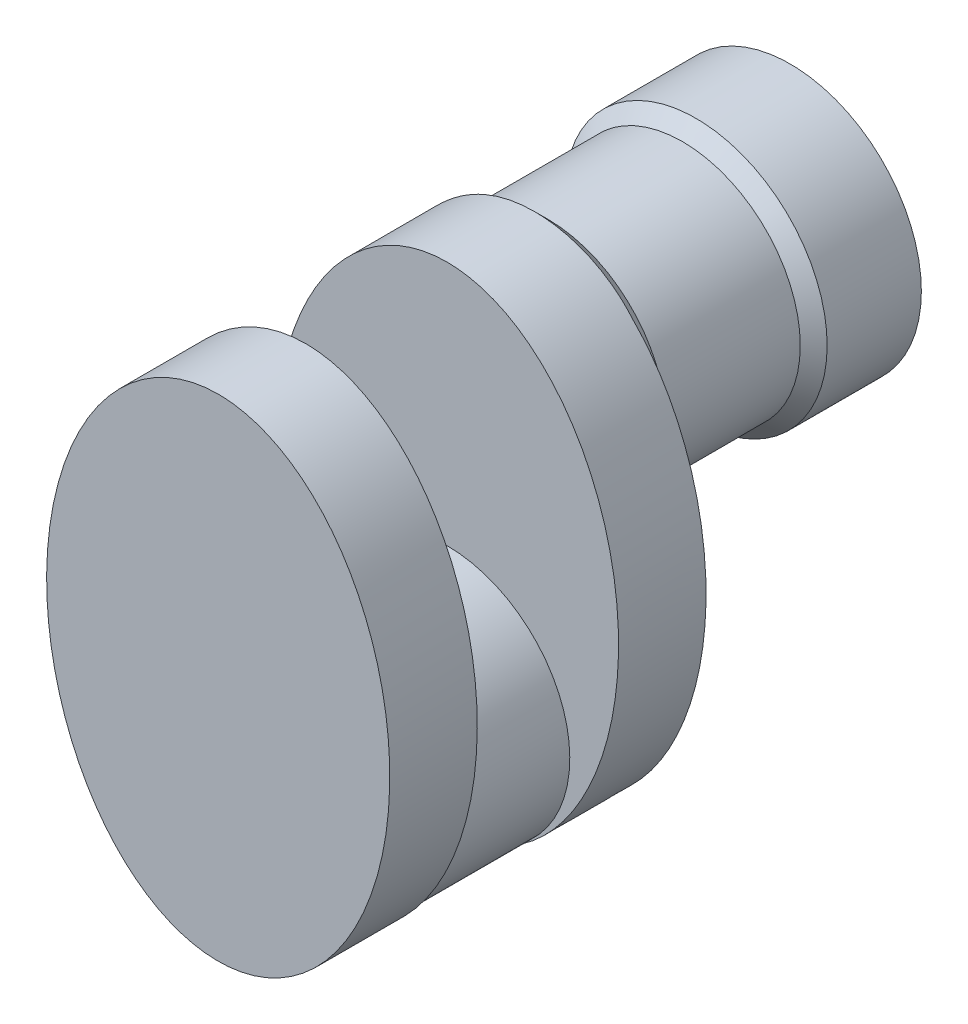
ISO-10303-21;
HEADER;
FILE_DESCRIPTION(('STEP AP214'),'2;1');
FILE_NAME('part.step','',(''),(''),'','','');
FILE_SCHEMA(('AUTOMOTIVE_DESIGN { 1 0 10303 214 1 1 1 1 }'));
ENDSEC;
DATA;
#1=APPLICATION_CONTEXT('core data for automotive mechanical design processes');
#2=APPLICATION_PROTOCOL_DEFINITION('international standard','automotive_design',2000,#1);
#3=PRODUCT_CONTEXT('',#1,'mechanical');
#4=PRODUCT('Part','Part','',(#3));
#5=PRODUCT_RELATED_PRODUCT_CATEGORY('part','',(#4));
#6=PRODUCT_DEFINITION_FORMATION('','',#4);
#7=PRODUCT_DEFINITION_CONTEXT('part definition',#1,'design');
#8=PRODUCT_DEFINITION('design','',#6,#7);
#9=PRODUCT_DEFINITION_SHAPE('','',#8);
#10=(LENGTH_UNIT() NAMED_UNIT(*) SI_UNIT(.MILLI.,.METRE.));
#11=(NAMED_UNIT(*) PLANE_ANGLE_UNIT() SI_UNIT($,.RADIAN.));
#12=(NAMED_UNIT(*) SI_UNIT($,.STERADIAN.) SOLID_ANGLE_UNIT());
#13=UNCERTAINTY_MEASURE_WITH_UNIT(LENGTH_MEASURE(1.E-05),#10,'distance_accuracy_value','');
#14=(GEOMETRIC_REPRESENTATION_CONTEXT(3) GLOBAL_UNCERTAINTY_ASSIGNED_CONTEXT((#13)) GLOBAL_UNIT_ASSIGNED_CONTEXT((#10,
#11,#12)) REPRESENTATION_CONTEXT('',''));
#15=CARTESIAN_POINT('',(0.,0.,0.));
#16=DIRECTION('',(0.,0.,1.));
#17=DIRECTION('',(1.,0.,0.));
#18=AXIS2_PLACEMENT_3D('',#15,#16,#17);
#19=CARTESIAN_POINT('',(0.,-35.25,72.));
#20=DIRECTION('',(0.,0.,1.));
#21=DIRECTION('',(1.,0.,0.));
#22=AXIS2_PLACEMENT_3D('',#19,#20,#21);
#23=PLANE('',#22);
#24=CARTESIAN_POINT('',(0.,-17.,72.));
#25=DIRECTION('',(0.,0.,1.));
#26=DIRECTION('',(1.34071928202209E-13,1.,0.));
#27=AXIS2_PLACEMENT_3D('',#24,#25,#26);
#28=ELLIPSE('',#27,36.5,25.5000000000008);
#29=CARTESIAN_POINT('',(-7.68989721660896,-51.8007697947258,72.));
#30=VERTEX_POINT('',#29);
#31=CARTESIAN_POINT('',(-1.05293436568648E-10,-53.5,72.));
#32=VERTEX_POINT('',#31);
#33=EDGE_CURVE('E44',#30,#32,#28,.T.);
#34=ORIENTED_EDGE('',*,*,#33,.F.);
#35=CARTESIAN_POINT('',(0.,-35.25,72.));
#36=DIRECTION('',(0.,0.,1.));
#37=DIRECTION('',(1.,0.,0.));
#38=AXIS2_PLACEMENT_3D('',#35,#36,#37);
#39=CIRCLE('',#38,18.25);
#40=EDGE_CURVE('E80',#30,#32,#39,.T.);
#41=ORIENTED_EDGE('',*,*,#40,.T.);
#42=EDGE_LOOP('',(#34,#41));
#43=FACE_BOUND('',#42,.T.);
#44=ADVANCED_FACE('F33',(#43),#23,.T.);
#45=CARTESIAN_POINT('',(0.,0.,14.));
#46=DIRECTION('',(0.,0.,-1.));
#47=DIRECTION('',(-1.,0.,0.));
#48=AXIS2_PLACEMENT_3D('',#45,#46,#47);
#49=CYLINDRICAL_SURFACE('',#48,19.5);
#50=CARTESIAN_POINT('',(0.,0.,14.));
#51=DIRECTION('',(0.,0.,1.));
#52=DIRECTION('',(1.,0.,0.));
#53=AXIS2_PLACEMENT_3D('',#50,#51,#52);
#54=CIRCLE('',#53,19.5);
#55=CARTESIAN_POINT('',(19.5,0.,14.));
#56=VERTEX_POINT('',#55);
#57=EDGE_CURVE('E205',#56,#56,#54,.T.);
#58=ORIENTED_EDGE('',*,*,#57,.F.);
#59=EDGE_LOOP('',(#58));
#60=FACE_BOUND('',#59,.T.);
#61=CARTESIAN_POINT('',(0.,0.,0.));
#62=DIRECTION('',(0.,0.,1.));
#63=DIRECTION('',(1.,0.,0.));
#64=AXIS2_PLACEMENT_3D('',#61,#62,#63);
#65=CIRCLE('',#64,19.5);
#66=CARTESIAN_POINT('',(19.5,0.,0.));
#67=VERTEX_POINT('',#66);
#68=EDGE_CURVE('E108',#67,#67,#65,.T.);
#69=ORIENTED_EDGE('',*,*,#68,.T.);
#70=EDGE_LOOP('',(#69));
#71=FACE_BOUND('',#70,.T.);
#72=ADVANCED_FACE('F147',(#60,#71),#49,.T.);
#73=CARTESIAN_POINT('',(0.,0.,0.));
#74=DIRECTION('',(0.,0.,1.));
#75=DIRECTION('',(1.,0.,0.));
#76=AXIS2_PLACEMENT_3D('',#73,#74,#75);
#77=PLANE('',#76);
#78=ORIENTED_EDGE('',*,*,#68,.F.);
#79=EDGE_LOOP('',(#78));
#80=FACE_BOUND('',#79,.T.);
#81=ADVANCED_FACE('F150',(#80),#77,.F.);
#82=CARTESIAN_POINT('',(0.,0.,38.));
#83=DIRECTION('',(0.,0.,-1.));
#84=DIRECTION('',(-1.,0.,0.));
#85=AXIS2_PLACEMENT_3D('',#82,#83,#84);
#86=CYLINDRICAL_SURFACE('',#85,17.5);
#87=CARTESIAN_POINT('',(0.,0.,16.));
#88=DIRECTION('',(0.,0.,1.));
#89=DIRECTION('',(1.,0.,0.));
#90=AXIS2_PLACEMENT_3D('',#87,#88,#89);
#91=CIRCLE('',#90,17.5);
#92=CARTESIAN_POINT('',(17.5,0.,16.));
#93=VERTEX_POINT('',#92);
#94=EDGE_CURVE('E37',#93,#93,#91,.T.);
#95=ORIENTED_EDGE('',*,*,#94,.T.);
#96=EDGE_LOOP('',(#95));
#97=FACE_BOUND('',#96,.T.);
#98=CARTESIAN_POINT('',(0.,0.,36.));
#99=DIRECTION('',(0.,0.,-1.));
#100=DIRECTION('',(-1.,0.,0.));
#101=AXIS2_PLACEMENT_3D('',#98,#99,#100);
#102=CIRCLE('',#101,17.5);
#103=CARTESIAN_POINT('',(-17.5,0.,36.));
#104=VERTEX_POINT('',#103);
#105=EDGE_CURVE('E211',#104,#104,#102,.T.);
#106=ORIENTED_EDGE('',*,*,#105,.T.);
#107=EDGE_LOOP('',(#106));
#108=FACE_BOUND('',#107,.T.);
#109=ADVANCED_FACE('F124',(#97,#108),#86,.T.);
#110=CARTESIAN_POINT('',(0.,19.5,51.));
#111=CARTESIAN_POINT('',(-51.,19.5,51.));
#112=CARTESIAN_POINT('',(-51.,-53.5,51.));
#113=CARTESIAN_POINT('',(0.,-53.5,51.));
#114=CARTESIAN_POINT('',(51.,-53.5,51.));
#115=CARTESIAN_POINT('',(51.,19.5,51.));
#116=CARTESIAN_POINT('',(0.,19.5,51.));
#117=(BOUNDED_CURVE() B_SPLINE_CURVE(3,(#110,#111,#112,#113,#114,#115,#116),.UNSPECIFIED.,.T.,
.F.) B_SPLINE_CURVE_WITH_KNOTS((4,3,4),(0.,0.5,1.),
.UNSPECIFIED.) CURVE() GEOMETRIC_REPRESENTATION_ITEM() RATIONAL_B_SPLINE_CURVE((1.,
0.333333333333333,0.333333333333333,1.,0.333333333333333,0.333333333333333,1.)) REPRESENTATION_ITEM(''));
#118=DIRECTION('',(0.,0.,-1.));
#119=VECTOR('',#118,1.);
#120=SURFACE_OF_LINEAR_EXTRUSION('',#117,#119);
#121=CARTESIAN_POINT('',(-7.68989721661727,-51.8007697947214,51.));
#122=VERTEX_POINT('',#121);
#123=CARTESIAN_POINT('',(0.,-53.5,51.));
#124=VERTEX_POINT('',#123);
#125=EDGE_CURVE('E102',#122,#124,#117,.T.);
#126=ORIENTED_EDGE('',*,*,#125,.F.);
#127=CARTESIAN_POINT('',(7.68989721661881,-51.8007697947207,51.));
#128=VERTEX_POINT('',#127);
#129=EDGE_CURVE('E110',#128,#122,#117,.T.);
#130=ORIENTED_EDGE('',*,*,#129,.F.);
#131=EDGE_CURVE('E109',#124,#128,#117,.T.);
#132=ORIENTED_EDGE('',*,*,#131,.F.);
#133=EDGE_LOOP('',(#126,#130,#132));
#134=FACE_BOUND('',#133,.T.);
#135=CARTESIAN_POINT('',(14.60811745982,12.9171554252515,38.));
#136=CARTESIAN_POINT('',(14.2927742499427,13.2326370740704,37.9727136455101));
#137=CARTESIAN_POINT('',(13.9695920127317,13.5407386195564,37.9499803627756));
#138=CARTESIAN_POINT('',(13.3072850357675,14.1408228293216,37.9125577206413));
#139=CARTESIAN_POINT('',(12.9681374350328,14.4327809923639,37.8978803019581));
#140=CARTESIAN_POINT('',(12.2743931945022,14.9984195903248,37.8755760848881));
#141=CARTESIAN_POINT('',(11.9197888141762,15.2720906894807,37.8679528626209));
#142=CARTESIAN_POINT('',(11.1930997294486,15.800983048123,37.8585434737323));
#143=CARTESIAN_POINT('',(10.8209083486075,16.0560587240014,37.8567993457507));
#144=CARTESIAN_POINT('',(10.0621796136412,16.5434870129539,37.8579749020792));
#145=CARTESIAN_POINT('',(9.67564943754109,16.7758507894103,37.860892282801));
#146=CARTESIAN_POINT('',(8.88898471183487,17.2159176555356,37.8700509417306));
#147=CARTESIAN_POINT('',(8.48885547798107,17.4236302417102,37.876290934835));
#148=CARTESIAN_POINT('',(7.76480315869535,17.7699808772633,37.889183442214));
#149=CARTESIAN_POINT('',(7.44333980086731,17.9137933523019,37.8954476642651));
#150=CARTESIAN_POINT('',(6.79326955911632,18.1842916757791,37.9085829094265));
#151=CARTESIAN_POINT('',(6.46466250688687,18.3109771201936,37.915453946845));
#152=CARTESIAN_POINT('',(5.80100932069747,18.5463490477884,37.9292264821681));
#153=CARTESIAN_POINT('',(5.46596236056879,18.6550332041694,37.9361279838922));
#154=CARTESIAN_POINT('',(4.79195647763287,18.8530946733335,37.9494034233268));
#155=CARTESIAN_POINT('',(4.45302442272968,18.9425631028061,37.955779758266));
#156=CARTESIAN_POINT('',(3.77065513639291,19.102145565902,37.9675906401879));
#157=CARTESIAN_POINT('',(3.42721847630862,19.1722620296675,37.9730253053897));
#158=CARTESIAN_POINT('',(2.73704422224762,19.2925458544181,37.9825850754409));
#159=CARTESIAN_POINT('',(2.39030860793803,19.3427244912226,37.9867109202254));
#160=CARTESIAN_POINT('',(1.70362487738165,19.421698386266,37.9932927501662));
#161=CARTESIAN_POINT('',(1.3637378064555,19.451020865451,37.9957897636474));
#162=CARTESIAN_POINT('',(0.6825713621864,19.4901936827456,37.9991531322877));
#163=CARTESIAN_POINT('',(0.341291111074469,19.5000288473175,38.0000182167421));
#164=CARTESIAN_POINT('',(0.,19.5,38.));
#165=B_SPLINE_CURVE_WITH_KNOTS('',3,(#135,#136,#137,#138,#139,#140,#141,#142,#143,#144,#145,
#146,#147,#148,#149,#150,#151,#152,#153,#154,#155,#156,#157,#158,#159,#160,#161,#162,#163,#164),
.UNSPECIFIED.,.F.,.F.,(4,2,2,2,2,2,2,2,2,2,2,2,2,2,4),(0.,1.34059665211231,2.68317505933438,
4.02643371339177,5.37927723250357,6.73145242060466,8.0831050006612,9.13931600886131,
10.1955519285775,11.2519242682113,12.3031711751187,13.3542860105281,14.4048055398992,
15.4277218402724,16.451434308279),.UNSPECIFIED.);
#166=CARTESIAN_POINT('',(14.6081174598181,12.9171554252497,38.));
#167=VERTEX_POINT('',#166);
#168=CARTESIAN_POINT('',(0.,19.5,38.));
#169=VERTEX_POINT('',#168);
#170=EDGE_CURVE('E131',#167,#169,#165,.T.);
#171=ORIENTED_EDGE('',*,*,#170,.T.);
#172=CARTESIAN_POINT('',(0.,19.5,38.));
#173=CARTESIAN_POINT('',(-0.324057785561838,19.5000236679001,38.0000148807909));
#174=CARTESIAN_POINT('',(-0.648108439216607,19.4911589385576,37.9992364721004));
#175=CARTESIAN_POINT('',(-1.29507862559065,19.4558333065056,37.9962014762266));
#176=CARTESIAN_POINT('',(-1.61799864846425,19.4293813267402,37.99394563863));
#177=CARTESIAN_POINT('',(-2.26186624928387,19.3590674895622,37.9880644840525));
#178=CARTESIAN_POINT('',(-2.58281415458623,19.3152086054355,37.9844394009586));
#179=CARTESIAN_POINT('',(-3.21983111412921,19.2107493222509,37.9760549738126));
#180=CARTESIAN_POINT('',(-3.53591827417315,19.1502584849036,37.97130307979));
#181=CARTESIAN_POINT('',(-4.16451416309366,19.0128302819514,37.9609201285918));
#182=CARTESIAN_POINT('',(-4.4770225359047,18.935891294588,37.9552889847385));
#183=CARTESIAN_POINT('',(-5.0976597313081,18.7660939769798,37.9434800694865));
#184=CARTESIAN_POINT('',(-5.40578842698099,18.6732351864064,37.937302282284));
#185=CARTESIAN_POINT('',(-6.19593720969445,18.4133076921506,37.9211115080005));
#186=CARTESIAN_POINT('',(-6.67417519517809,18.2346157202537,37.9109701989652));
#187=CARTESIAN_POINT('',(-7.61560685809847,17.841298914764,37.8919870062621));
#188=CARTESIAN_POINT('',(-8.07879945860685,17.6266715156996,37.8831452154531));
#189=CARTESIAN_POINT('',(-8.98946758729319,17.1637627902784,37.8686296815843));
#190=CARTESIAN_POINT('',(-9.43690262723998,16.915401750268,37.8629636105298));
#191=CARTESIAN_POINT('',(-10.3134910724796,16.3883679099967,37.8567874845988));
#192=CARTESIAN_POINT('',(-10.742646625872,16.1096986851305,37.8562768222147));
#193=CARTESIAN_POINT('',(-11.4714196898017,15.6018428575588,37.8615301655684));
#194=CARTESIAN_POINT('',(-11.7754344146429,15.3789045032357,37.8656800658381));
#195=CARTESIAN_POINT('',(-12.3727540748335,14.9192839177057,37.8785482644643));
#196=CARTESIAN_POINT('',(-12.6660599820565,14.6826029387795,37.8872661471478));
#197=CARTESIAN_POINT('',(-13.2404977641053,14.1976805909249,37.9099052425757));
#198=CARTESIAN_POINT('',(-13.5216779190528,13.9494952295732,37.9238031754128));
#199=CARTESIAN_POINT('',(-14.0731156152267,13.4416607346775,37.9574012203767));
#200=CARTESIAN_POINT('',(-14.3433735039849,13.1820119664347,37.9771011477263));
#201=CARTESIAN_POINT('',(-14.6081174598484,12.9171554252193,38.));
#202=B_SPLINE_CURVE_WITH_KNOTS('',3,(#172,#173,#174,#175,#176,#177,#178,#179,#180,#181,#182,
#183,#184,#185,#186,#187,#188,#189,#190,#191,#192,#193,#194,#195,#196,#197,#198,#199,#200,#201),
.UNSPECIFIED.,.F.,.F.,(4,2,2,2,2,2,2,2,2,2,2,2,2,2,4),(0.,0.972039749481276,1.94358670762693,
2.91496778649943,3.88009724795055,4.84532191337926,5.81057449343599,7.34080599039561,
8.87114677896617,10.4051688519339,11.9390101553305,13.0696581148788,14.2002032066599,
15.3257275519488,16.4512160563294),.UNSPECIFIED.);
#203=CARTESIAN_POINT('',(-14.6081174598484,12.9171554252193,38.));
#204=VERTEX_POINT('',#203);
#205=EDGE_CURVE('E137',#169,#204,#202,.T.);
#206=ORIENTED_EDGE('',*,*,#205,.T.);
#207=CARTESIAN_POINT('',(0.,19.5,38.));
#208=CARTESIAN_POINT('',(-51.,19.5,38.));
#209=CARTESIAN_POINT('',(-51.,-53.5,38.));
#210=CARTESIAN_POINT('',(0.,-53.5,38.));
#211=CARTESIAN_POINT('',(51.,-53.5,38.));
#212=CARTESIAN_POINT('',(51.,19.5,38.));
#213=CARTESIAN_POINT('',(0.,19.5,38.));
#214=(BOUNDED_CURVE() B_SPLINE_CURVE(3,(#207,#208,#209,#210,#211,#212,#213),.UNSPECIFIED.,.T.,
.F.) B_SPLINE_CURVE_WITH_KNOTS((4,3,4),(0.,0.5,1.),
.UNSPECIFIED.) CURVE() GEOMETRIC_REPRESENTATION_ITEM() RATIONAL_B_SPLINE_CURVE((1.,
0.333333333333333,0.333333333333333,1.,0.333333333333333,0.333333333333333,1.)) REPRESENTATION_ITEM(''));
#215=EDGE_CURVE('E99',#204,#167,#214,.T.);
#216=ORIENTED_EDGE('',*,*,#215,.T.);
#217=EDGE_LOOP('',(#171,#206,#216));
#218=FACE_BOUND('',#217,.T.);
#219=ADVANCED_FACE('F118',(#134,#218),#120,.F.);
#220=CARTESIAN_POINT('',(0.,-53.5,51.));
#221=DIRECTION('',(0.,0.,-1.));
#222=DIRECTION('',(-1.,0.,0.));
#223=AXIS2_PLACEMENT_3D('',#220,#221,#222);
#224=PLANE('',#223);
#225=CARTESIAN_POINT('',(0.,-35.25,51.));
#226=DIRECTION('',(0.,0.,1.));
#227=DIRECTION('',(1.,0.,0.));
#228=AXIS2_PLACEMENT_3D('',#225,#226,#227);
#229=CIRCLE('',#228,18.25);
#230=EDGE_CURVE('E42',#128,#122,#229,.T.);
#231=ORIENTED_EDGE('',*,*,#230,.F.);
#232=ORIENTED_EDGE('',*,*,#129,.T.);
#233=EDGE_LOOP('',(#231,#232));
#234=FACE_BOUND('',#233,.T.);
#235=ADVANCED_FACE('F123',(#234),#224,.F.);
#236=CARTESIAN_POINT('',(0.,-53.5,38.));
#237=DIRECTION('',(0.,0.,-1.));
#238=DIRECTION('',(-1.,0.,0.));
#239=AXIS2_PLACEMENT_3D('',#236,#237,#238);
#240=PLANE('',#239);
#241=ORIENTED_EDGE('',*,*,#215,.F.);
#242=CARTESIAN_POINT('',(0.,0.,38.));
#243=DIRECTION('',(0.,0.,-1.));
#244=DIRECTION('',(-1.,0.,0.));
#245=AXIS2_PLACEMENT_3D('',#242,#243,#244);
#246=CIRCLE('',#245,19.5);
#247=EDGE_CURVE('E212',#204,#167,#246,.F.);
#248=ORIENTED_EDGE('',*,*,#247,.T.);
#249=EDGE_LOOP('',(#241,#248));
#250=FACE_BOUND('',#249,.T.);
#251=ADVANCED_FACE('F126',(#250),#240,.T.);
#252=CARTESIAN_POINT('',(0.,0.,38.));
#253=DIRECTION('',(0.,0.,1.));
#254=DIRECTION('',(1.,0.,0.));
#255=AXIS2_PLACEMENT_3D('',#252,#253,#254);
#256=CONICAL_SURFACE('',#255,19.5,0.785398163397456);
#257=ORIENTED_EDGE('',*,*,#105,.F.);
#258=EDGE_LOOP('',(#257));
#259=FACE_BOUND('',#258,.T.);
#260=ORIENTED_EDGE('',*,*,#170,.F.);
#261=ORIENTED_EDGE('',*,*,#247,.F.);
#262=ORIENTED_EDGE('',*,*,#205,.F.);
#263=EDGE_LOOP('',(#260,#261,#262));
#264=FACE_BOUND('',#263,.T.);
#265=ADVANCED_FACE('F142',(#259,#264),#256,.T.);
#266=CARTESIAN_POINT('',(0.,0.,16.));
#267=DIRECTION('',(0.,0.,-1.));
#268=DIRECTION('',(-1.,0.,0.));
#269=AXIS2_PLACEMENT_3D('',#266,#267,#268);
#270=CONICAL_SURFACE('',#269,17.5,0.785398163397441);
#271=ORIENTED_EDGE('',*,*,#57,.T.);
#272=EDGE_LOOP('',(#271));
#273=FACE_BOUND('',#272,.T.);
#274=ORIENTED_EDGE('',*,*,#94,.F.);
#275=EDGE_LOOP('',(#274));
#276=FACE_BOUND('',#275,.T.);
#277=ADVANCED_FACE('F35',(#273,#276),#270,.T.);
#278=CARTESIAN_POINT('',(0.,-35.25,51.));
#279=DIRECTION('',(0.,0.,1.));
#280=DIRECTION('',(1.,0.,0.));
#281=AXIS2_PLACEMENT_3D('',#278,#279,#280);
#282=PLANE('',#281);
#283=EDGE_CURVE('E89',#122,#124,#229,.T.);
#284=ORIENTED_EDGE('',*,*,#283,.F.);
#285=ORIENTED_EDGE('',*,*,#125,.T.);
#286=EDGE_LOOP('',(#284,#285));
#287=FACE_BOUND('',#286,.T.);
#288=ADVANCED_FACE('F178',(#287),#282,.F.);
#289=EDGE_CURVE('E95',#124,#128,#229,.T.);
#290=ORIENTED_EDGE('',*,*,#289,.F.);
#291=ORIENTED_EDGE('',*,*,#131,.T.);
#292=EDGE_LOOP('',(#290,#291));
#293=FACE_BOUND('',#292,.T.);
#294=ADVANCED_FACE('F173',(#293),#282,.F.);
#295=CARTESIAN_POINT('',(0.,-35.25,72.));
#296=DIRECTION('',(0.,0.,-1.));
#297=DIRECTION('',(-1.,0.,0.));
#298=AXIS2_PLACEMENT_3D('',#295,#296,#297);
#299=CYLINDRICAL_SURFACE('',#298,18.25);
#300=ORIENTED_EDGE('',*,*,#40,.F.);
#301=CARTESIAN_POINT('',(7.68989721679128,-51.8007697946416,72.));
#302=VERTEX_POINT('',#301);
#303=EDGE_CURVE('E81',#302,#30,#39,.T.);
#304=ORIENTED_EDGE('',*,*,#303,.F.);
#305=EDGE_CURVE('E76',#32,#302,#39,.T.);
#306=ORIENTED_EDGE('',*,*,#305,.F.);
#307=EDGE_LOOP('',(#300,#304,#306));
#308=FACE_BOUND('',#307,.T.);
#309=ORIENTED_EDGE('',*,*,#283,.T.);
#310=ORIENTED_EDGE('',*,*,#289,.T.);
#311=ORIENTED_EDGE('',*,*,#230,.T.);
#312=EDGE_LOOP('',(#309,#310,#311));
#313=FACE_BOUND('',#312,.T.);
#314=ADVANCED_FACE('F85',(#308,#313),#299,.T.);
#315=EDGE_CURVE('E11',#32,#302,#28,.T.);
#316=ORIENTED_EDGE('',*,*,#315,.F.);
#317=ORIENTED_EDGE('',*,*,#305,.T.);
#318=EDGE_LOOP('',(#316,#317));
#319=FACE_BOUND('',#318,.T.);
#320=ADVANCED_FACE('F78',(#319),#23,.T.);
#321=CARTESIAN_POINT('',(0.,-17.,72.));
#322=DIRECTION('',(0.,0.,1.));
#323=DIRECTION('',(1.,0.,0.));
#324=AXIS2_PLACEMENT_3D('',#321,#322,#323);
#325=PLANE('',#324);
#326=EDGE_CURVE('E45',#302,#30,#28,.T.);
#327=ORIENTED_EDGE('',*,*,#326,.F.);
#328=ORIENTED_EDGE('',*,*,#303,.T.);
#329=EDGE_LOOP('',(#327,#328));
#330=FACE_BOUND('',#329,.T.);
#331=ADVANCED_FACE('F90',(#330),#325,.F.);
#332=CARTESIAN_POINT('',(0.,-17.,85.));
#333=DIRECTION('',(0.,0.,1.));
#334=DIRECTION('',(1.34071928202209E-13,1.,0.));
#335=AXIS2_PLACEMENT_3D('',#332,#333,#334);
#336=ELLIPSE('',#335,36.5,25.5000000000008);
#337=DIRECTION('',(0.,0.,-1.));
#338=VECTOR('',#337,1.);
#339=SURFACE_OF_LINEAR_EXTRUSION('',#336,#338);
#340=CARTESIAN_POINT('',(4.89362537938062E-12,19.5,85.));
#341=VERTEX_POINT('',#340);
#342=EDGE_CURVE('E93',#341,#341,#336,.T.);
#343=ORIENTED_EDGE('',*,*,#342,.F.);
#344=EDGE_LOOP('',(#343));
#345=FACE_BOUND('',#344,.T.);
#346=ORIENTED_EDGE('',*,*,#33,.T.);
#347=ORIENTED_EDGE('',*,*,#315,.T.);
#348=ORIENTED_EDGE('',*,*,#326,.T.);
#349=EDGE_LOOP('',(#346,#347,#348));
#350=FACE_BOUND('',#349,.T.);
#351=ADVANCED_FACE('F92',(#345,#350),#339,.F.);
#352=CARTESIAN_POINT('',(0.,-17.,85.));
#353=DIRECTION('',(0.,0.,1.));
#354=DIRECTION('',(1.,0.,0.));
#355=AXIS2_PLACEMENT_3D('',#352,#353,#354);
#356=PLANE('',#355);
#357=ORIENTED_EDGE('',*,*,#342,.T.);
#358=EDGE_LOOP('',(#357));
#359=FACE_BOUND('',#358,.T.);
#360=ADVANCED_FACE('F287',(#359),#356,.T.);
#361=CLOSED_SHELL('',(#44,#72,#81,#109,#219,#235,#251,#265,#277,#288,#294,#314,#320,#331,#351,#360));
#362=MANIFOLD_SOLID_BREP('B2',#361);
#363=ADVANCED_BREP_SHAPE_REPRESENTATION('',(#18,#362),#14);
#364=SHAPE_DEFINITION_REPRESENTATION(#9,#363);
ENDSEC;
END-ISO-10303-21;
